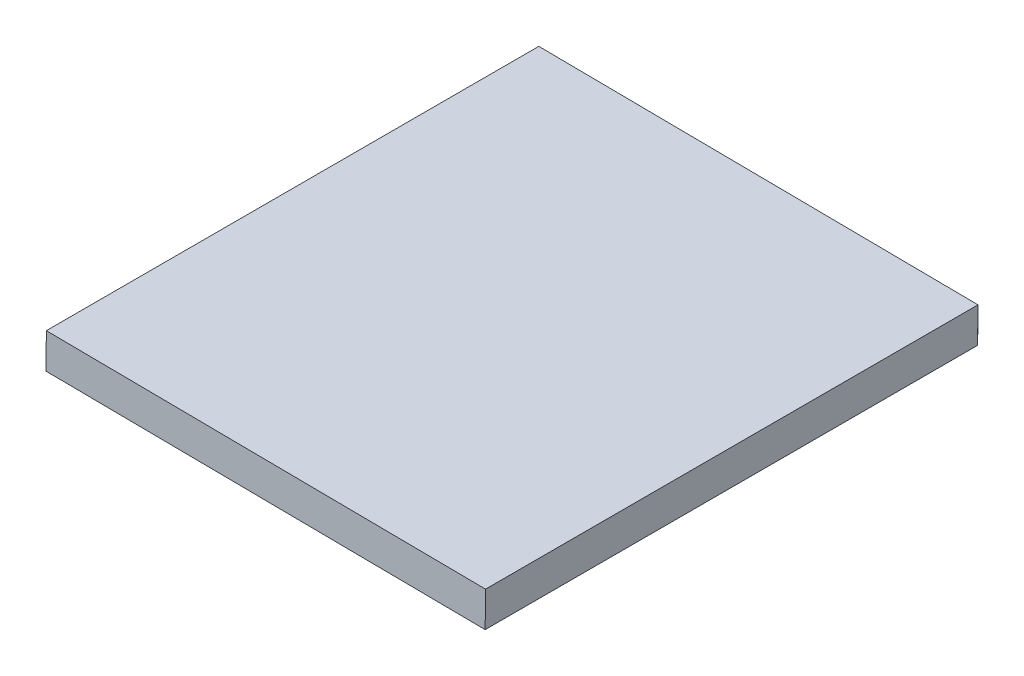
ISO-10303-21;
HEADER;
FILE_DESCRIPTION(('STEP AP214'),'2;1');
FILE_NAME('part.step','',(''),(''),'','','');
FILE_SCHEMA(('AUTOMOTIVE_DESIGN { 1 0 10303 214 1 1 1 1 }'));
ENDSEC;
DATA;
#1=APPLICATION_CONTEXT('core data for automotive mechanical design processes');
#2=APPLICATION_PROTOCOL_DEFINITION('international standard','automotive_design',2000,#1);
#3=PRODUCT_CONTEXT('',#1,'mechanical');
#4=PRODUCT('Part','Part','',(#3));
#5=PRODUCT_RELATED_PRODUCT_CATEGORY('part','',(#4));
#6=PRODUCT_DEFINITION_FORMATION('','',#4);
#7=PRODUCT_DEFINITION_CONTEXT('part definition',#1,'design');
#8=PRODUCT_DEFINITION('design','',#6,#7);
#9=PRODUCT_DEFINITION_SHAPE('','',#8);
#10=(LENGTH_UNIT() NAMED_UNIT(*) SI_UNIT(.MILLI.,.METRE.));
#11=(NAMED_UNIT(*) PLANE_ANGLE_UNIT() SI_UNIT($,.RADIAN.));
#12=(NAMED_UNIT(*) SI_UNIT($,.STERADIAN.) SOLID_ANGLE_UNIT());
#13=UNCERTAINTY_MEASURE_WITH_UNIT(LENGTH_MEASURE(1.E-05),#10,'distance_accuracy_value','');
#14=(GEOMETRIC_REPRESENTATION_CONTEXT(3) GLOBAL_UNCERTAINTY_ASSIGNED_CONTEXT((#13)) GLOBAL_UNIT_ASSIGNED_CONTEXT((#10,
#11,#12)) REPRESENTATION_CONTEXT('',''));
#15=CARTESIAN_POINT('',(0.,0.,0.));
#16=DIRECTION('',(0.,0.,1.));
#17=DIRECTION('',(1.,0.,0.));
#18=AXIS2_PLACEMENT_3D('',#15,#16,#17);
#19=CARTESIAN_POINT('',(31.726933583804,-5.00391352469326,7.57393102133329));
#20=DIRECTION('',(-0.999952636363047,0.0097326784901733,0.));
#21=DIRECTION('',(-0.0097326784901733,-0.999952636363047,0.));
#22=AXIS2_PLACEMENT_3D('',#19,#20,#21);
#23=PLANE('',#22);
#24=DIRECTION('',(0.,0.,-1.));
#25=VECTOR('',#24,1.);
#26=CARTESIAN_POINT('',(31.7221016113203,-5.50035894090077,7.57393102133329));
#27=LINE('',#26,#25);
#28=CARTESIAN_POINT('',(31.7221016113203,-5.50035894090077,7.57393102133329));
#29=VERTEX_POINT('',#28);
#30=CARTESIAN_POINT('',(31.7221016113203,-5.50035894090077,0.64051223740443));
#31=VERTEX_POINT('',#30);
#32=EDGE_CURVE('E91',#29,#31,#27,.T.);
#33=ORIENTED_EDGE('',*,*,#32,.F.);
#34=DIRECTION('',(-0.0097326784901733,-0.999952636363047,0.));
#35=VECTOR('',#34,1.);
#36=CARTESIAN_POINT('',(31.726933583804,-5.00391352469326,7.57393102133329));
#37=LINE('',#36,#35);
#38=CARTESIAN_POINT('',(31.726933583804,-5.00391352469326,7.57393102133329));
#39=VERTEX_POINT('',#38);
#40=EDGE_CURVE('E32',#39,#29,#37,.T.);
#41=ORIENTED_EDGE('',*,*,#40,.F.);
#42=DIRECTION('',(0.,0.,-1.));
#43=VECTOR('',#42,1.);
#44=CARTESIAN_POINT('',(31.726933583804,-5.00391352469326,7.57393102133329));
#45=LINE('',#44,#43);
#46=CARTESIAN_POINT('',(31.726933583804,-5.00391352469326,0.64051223740443));
#47=VERTEX_POINT('',#46);
#48=EDGE_CURVE('E102',#39,#47,#45,.T.);
#49=ORIENTED_EDGE('',*,*,#48,.T.);
#50=DIRECTION('',(-0.0097326784901733,-0.999952636363047,0.));
#51=VECTOR('',#50,1.);
#52=CARTESIAN_POINT('',(31.726933583804,-5.00391352469326,0.64051223740443));
#53=LINE('',#52,#51);
#54=EDGE_CURVE('E10',#47,#31,#53,.T.);
#55=ORIENTED_EDGE('',*,*,#54,.T.);
#56=EDGE_LOOP('',(#33,#41,#49,#55));
#57=FACE_BOUND('',#56,.T.);
#58=ADVANCED_FACE('F16',(#57),#23,.T.);
#59=CARTESIAN_POINT('',(31.726933583804,-5.00391352469326,0.640512237404433));
#60=DIRECTION('',(0.,0.,-1.));
#61=DIRECTION('',(-1.,0.,0.));
#62=AXIS2_PLACEMENT_3D('',#59,#60,#61);
#63=PLANE('',#62);
#64=DIRECTION('',(0.999952636363047,-0.0097326784901733,0.));
#65=VECTOR('',#64,1.);
#66=CARTESIAN_POINT('',(31.7221016113203,-5.50035894090077,0.640512237404433));
#67=LINE('',#66,#65);
#68=CARTESIAN_POINT('',(37.9055826963804,-5.56054362481724,0.640512237404431));
#69=VERTEX_POINT('',#68);
#70=EDGE_CURVE('E94',#31,#69,#67,.T.);
#71=ORIENTED_EDGE('',*,*,#70,.F.);
#72=ORIENTED_EDGE('',*,*,#54,.F.);
#73=DIRECTION('',(0.999952636363047,-0.0097326784901733,0.));
#74=VECTOR('',#73,1.);
#75=CARTESIAN_POINT('',(31.726933583804,-5.00391352469326,0.640512237404433));
#76=LINE('',#75,#74);
#77=CARTESIAN_POINT('',(37.910414668864,-5.06409820860974,0.640512237404431));
#78=VERTEX_POINT('',#77);
#79=EDGE_CURVE('E82',#47,#78,#76,.T.);
#80=ORIENTED_EDGE('',*,*,#79,.T.);
#81=DIRECTION('',(-0.0097326784901733,-0.999952636363047,0.));
#82=VECTOR('',#81,1.);
#83=CARTESIAN_POINT('',(37.910414668864,-5.06409820860974,0.640512237404431));
#84=LINE('',#83,#82);
#85=EDGE_CURVE('E24',#78,#69,#84,.T.);
#86=ORIENTED_EDGE('',*,*,#85,.T.);
#87=EDGE_LOOP('',(#71,#72,#80,#86));
#88=FACE_BOUND('',#87,.T.);
#89=ADVANCED_FACE('F104',(#88),#63,.T.);
#90=CARTESIAN_POINT('',(37.8187096205899,-5.06320563058322,0.732221629368865));
#91=DIRECTION('',(0.707073290037686,-0.00688204295951009,0.707106781186537));
#92=DIRECTION('',(0.707123526959251,0.,-0.70709003501726));
#93=AXIS2_PLACEMENT_3D('',#90,#91,#92);
#94=PLANE('',#93);
#95=DIRECTION('',(-0.707073290037666,0.00688204295951399,0.707106781186558));
#96=VECTOR('',#95,1.);
#97=CARTESIAN_POINT('',(37.8138776481063,-5.55965104679072,0.732221629368865));
#98=LINE('',#97,#96);
#99=CARTESIAN_POINT('',(37.9052212181191,-5.5605401064989,0.640873732787417));
#100=VERTEX_POINT('',#99);
#101=EDGE_CURVE('E97',#69,#100,#98,.T.);
#102=ORIENTED_EDGE('',*,*,#101,.F.);
#103=ORIENTED_EDGE('',*,*,#85,.F.);
#104=DIRECTION('',(-0.707073290037666,0.00688204295951399,0.707106781186558));
#105=VECTOR('',#104,1.);
#106=CARTESIAN_POINT('',(37.8187096205899,-5.06320563058322,0.732221629368865));
#107=LINE('',#106,#105);
#108=CARTESIAN_POINT('',(37.9100531906028,-5.0640946902914,0.640873732787417));
#109=VERTEX_POINT('',#108);
#110=EDGE_CURVE('E79',#78,#109,#107,.T.);
#111=ORIENTED_EDGE('',*,*,#110,.T.);
#112=DIRECTION('',(-0.0097326784901733,-0.999952636363047,0.));
#113=VECTOR('',#112,1.);
#114=CARTESIAN_POINT('',(37.9100531906028,-5.0640946902914,0.640873732787417));
#115=LINE('',#114,#113);
#116=EDGE_CURVE('E66',#109,#100,#115,.T.);
#117=ORIENTED_EDGE('',*,*,#116,.T.);
#118=EDGE_LOOP('',(#102,#103,#111,#117));
#119=FACE_BOUND('',#118,.T.);
#120=ADVANCED_FACE('F80',(#119),#94,.T.);
#121=CARTESIAN_POINT('',(37.9100531906028,-5.06409469029139,0.640512237404436));
#122=DIRECTION('',(0.999952636363047,-0.0097326784901733,0.));
#123=DIRECTION('',(0.0097326784901733,0.999952636363047,0.));
#124=AXIS2_PLACEMENT_3D('',#121,#122,#123);
#125=PLANE('',#124);
#126=DIRECTION('',(0.,0.,1.));
#127=VECTOR('',#126,1.);
#128=CARTESIAN_POINT('',(37.9052212181191,-5.5605401064989,0.640512237404436));
#129=LINE('',#128,#127);
#130=CARTESIAN_POINT('',(37.9052212180138,-5.56054010649788,7.57393102133329));
#131=VERTEX_POINT('',#130);
#132=EDGE_CURVE('E73',#100,#131,#129,.T.);
#133=ORIENTED_EDGE('',*,*,#132,.F.);
#134=ORIENTED_EDGE('',*,*,#116,.F.);
#135=DIRECTION('',(0.,0.,1.));
#136=VECTOR('',#135,1.);
#137=CARTESIAN_POINT('',(37.9100531906028,-5.06409469029139,0.640512237404436));
#138=LINE('',#137,#136);
#139=CARTESIAN_POINT('',(37.9100531904974,-5.06409469029037,7.57393102133329));
#140=VERTEX_POINT('',#139);
#141=EDGE_CURVE('E70',#109,#140,#138,.T.);
#142=ORIENTED_EDGE('',*,*,#141,.T.);
#143=DIRECTION('',(-0.0097326784901733,-0.999952636363047,0.));
#144=VECTOR('',#143,1.);
#145=CARTESIAN_POINT('',(37.9100531904974,-5.06409469029037,7.57393102133329));
#146=LINE('',#145,#144);
#147=EDGE_CURVE('E51',#140,#131,#146,.T.);
#148=ORIENTED_EDGE('',*,*,#147,.T.);
#149=EDGE_LOOP('',(#133,#134,#142,#148));
#150=FACE_BOUND('',#149,.T.);
#151=ADVANCED_FACE('F68',(#150),#125,.T.);
#152=CARTESIAN_POINT('',(37.9100531904974,-5.06409469029037,7.57393102133329));
#153=DIRECTION('',(0.,0.,1.));
#154=DIRECTION('',(1.,0.,0.));
#155=AXIS2_PLACEMENT_3D('',#152,#153,#154);
#156=PLANE('',#155);
#157=DIRECTION('',(-0.999952636363047,0.0097326784901733,0.));
#158=VECTOR('',#157,1.);
#159=CARTESIAN_POINT('',(37.9052212180138,-5.56054010649788,7.57393102133329));
#160=LINE('',#159,#158);
#161=EDGE_CURVE('E100',#131,#29,#160,.T.);
#162=ORIENTED_EDGE('',*,*,#161,.F.);
#163=ORIENTED_EDGE('',*,*,#147,.F.);
#164=DIRECTION('',(-0.999952636363047,0.0097326784901733,0.));
#165=VECTOR('',#164,1.);
#166=CARTESIAN_POINT('',(37.9100531904974,-5.06409469029037,7.57393102133329));
#167=LINE('',#166,#165);
#168=EDGE_CURVE('E86',#140,#39,#167,.T.);
#169=ORIENTED_EDGE('',*,*,#168,.T.);
#170=ORIENTED_EDGE('',*,*,#40,.T.);
#171=EDGE_LOOP('',(#162,#163,#169,#170));
#172=FACE_BOUND('',#171,.T.);
#173=ADVANCED_FACE('F120',(#172),#156,.T.);
#174=CARTESIAN_POINT('',(38.2860357021554,-5.06775418052104,3.64533695471891));
#175=DIRECTION('',(-0.0097326784901733,-0.999952636363047,0.));
#176=DIRECTION('',(0.999952636363047,-0.0097326784901733,0.));
#177=AXIS2_PLACEMENT_3D('',#174,#175,#176);
#178=PLANE('',#177);
#179=ORIENTED_EDGE('',*,*,#48,.F.);
#180=ORIENTED_EDGE('',*,*,#168,.F.);
#181=ORIENTED_EDGE('',*,*,#141,.F.);
#182=ORIENTED_EDGE('',*,*,#110,.F.);
#183=ORIENTED_EDGE('',*,*,#79,.F.);
#184=EDGE_LOOP('',(#179,#180,#181,#182,#183));
#185=FACE_BOUND('',#184,.T.);
#186=ADVANCED_FACE('F85',(#185),#178,.F.);
#187=CARTESIAN_POINT('',(38.2812037296718,-5.56419959672854,3.64533695471891));
#188=DIRECTION('',(-0.0097326784901733,-0.999952636363047,0.));
#189=DIRECTION('',(0.999952636363047,-0.0097326784901733,0.));
#190=AXIS2_PLACEMENT_3D('',#187,#188,#189);
#191=PLANE('',#190);
#192=ORIENTED_EDGE('',*,*,#32,.T.);
#193=ORIENTED_EDGE('',*,*,#70,.T.);
#194=ORIENTED_EDGE('',*,*,#101,.T.);
#195=ORIENTED_EDGE('',*,*,#132,.T.);
#196=ORIENTED_EDGE('',*,*,#161,.T.);
#197=EDGE_LOOP('',(#192,#193,#194,#195,#196));
#198=FACE_BOUND('',#197,.T.);
#199=ADVANCED_FACE('F106',(#198),#191,.T.);
#200=CLOSED_SHELL('',(#58,#89,#120,#151,#173,#186,#199));
#201=MANIFOLD_SOLID_BREP('B1',#200);
#202=ADVANCED_BREP_SHAPE_REPRESENTATION('',(#18,#201),#14);
#203=SHAPE_DEFINITION_REPRESENTATION(#9,#202);
ENDSEC;
END-ISO-10303-21;
